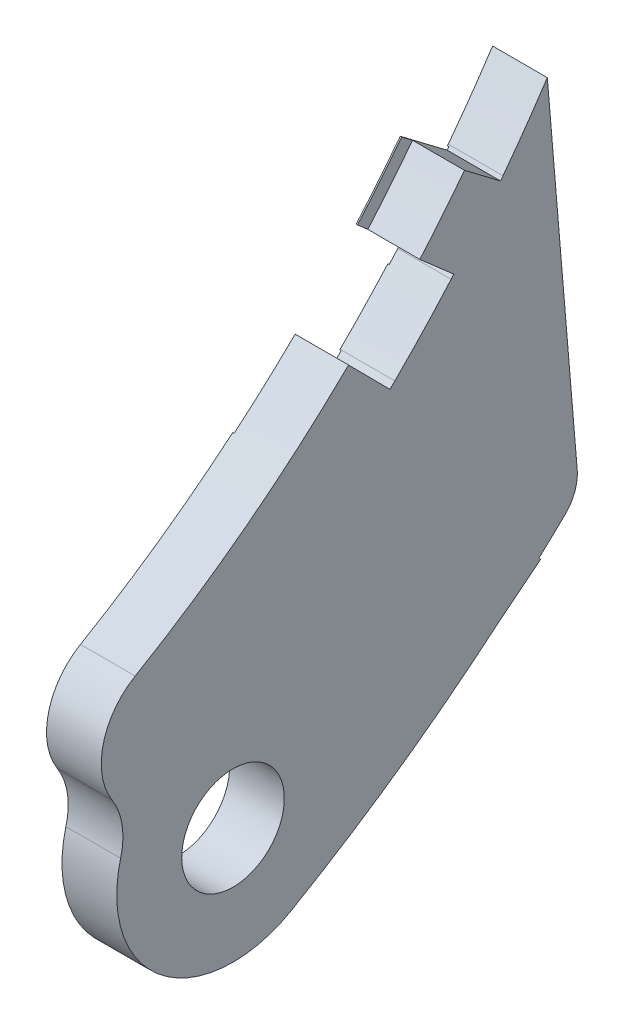
ISO-10303-21;
HEADER;
FILE_DESCRIPTION(('STEP AP214'),'2;1');
FILE_NAME('part.step','',(''),(''),'','','');
FILE_SCHEMA(('AUTOMOTIVE_DESIGN { 1 0 10303 214 1 1 1 1 }'));
ENDSEC;
DATA;
#1=APPLICATION_CONTEXT('core data for automotive mechanical design processes');
#2=APPLICATION_PROTOCOL_DEFINITION('international standard','automotive_design',2000,#1);
#3=PRODUCT_CONTEXT('',#1,'mechanical');
#4=PRODUCT('Part','Part','',(#3));
#5=PRODUCT_RELATED_PRODUCT_CATEGORY('part','',(#4));
#6=PRODUCT_DEFINITION_FORMATION('','',#4);
#7=PRODUCT_DEFINITION_CONTEXT('part definition',#1,'design');
#8=PRODUCT_DEFINITION('design','',#6,#7);
#9=PRODUCT_DEFINITION_SHAPE('','',#8);
#10=(LENGTH_UNIT() NAMED_UNIT(*) SI_UNIT(.MILLI.,.METRE.));
#11=(NAMED_UNIT(*) PLANE_ANGLE_UNIT() SI_UNIT($,.RADIAN.));
#12=(NAMED_UNIT(*) SI_UNIT($,.STERADIAN.) SOLID_ANGLE_UNIT());
#13=UNCERTAINTY_MEASURE_WITH_UNIT(LENGTH_MEASURE(1.E-05),#10,'distance_accuracy_value','');
#14=(GEOMETRIC_REPRESENTATION_CONTEXT(3) GLOBAL_UNCERTAINTY_ASSIGNED_CONTEXT((#13)) GLOBAL_UNIT_ASSIGNED_CONTEXT((#10,
#11,#12)) REPRESENTATION_CONTEXT('',''));
#15=CARTESIAN_POINT('',(0.,0.,0.));
#16=DIRECTION('',(0.,0.,1.));
#17=DIRECTION('',(1.,0.,0.));
#18=AXIS2_PLACEMENT_3D('',#15,#16,#17);
#19=CARTESIAN_POINT('',(-258.7,0.,0.));
#20=DIRECTION('',(-1.,0.,0.));
#21=DIRECTION('',(0.,0.,1.));
#22=AXIS2_PLACEMENT_3D('',#19,#20,#21);
#23=CYLINDRICAL_SURFACE('',#22,80.);
#24=DIRECTION('',(-1.,0.,0.));
#25=VECTOR('',#24,1.);
#26=CARTESIAN_POINT('',(-258.7,-52.4563861082984,-60.4013870408381));
#27=LINE('',#26,#25);
#28=CARTESIAN_POINT('',(-326.5,-52.4563861082984,-60.4013870408381));
#29=VERTEX_POINT('',#28);
#30=CARTESIAN_POINT('',(-326.4,-52.4563861082984,-60.4013870408381));
#31=VERTEX_POINT('',#30);
#32=EDGE_CURVE('E274',#29,#31,#27,.F.);
#33=ORIENTED_EDGE('',*,*,#32,.T.);
#34=CARTESIAN_POINT('',(-326.4,0.,0.));
#35=DIRECTION('',(1.,0.,0.));
#36=DIRECTION('',(0.,0.,-1.));
#37=AXIS2_PLACEMENT_3D('',#34,#35,#36);
#38=CIRCLE('',#37,80.);
#39=CARTESIAN_POINT('',(-326.4,-48.5017462472843,-63.6205989516292));
#40=VERTEX_POINT('',#39);
#41=EDGE_CURVE('E502',#31,#40,#38,.T.);
#42=ORIENTED_EDGE('',*,*,#41,.T.);
#43=DIRECTION('',(-1.,0.,0.));
#44=VECTOR('',#43,1.);
#45=CARTESIAN_POINT('',(-258.7,-48.5017462472843,-63.6205989516292));
#46=LINE('',#45,#44);
#47=CARTESIAN_POINT('',(-326.5,-48.5017462472843,-63.6205989516292));
#48=VERTEX_POINT('',#47);
#49=EDGE_CURVE('E266',#40,#48,#46,.T.);
#50=ORIENTED_EDGE('',*,*,#49,.T.);
#51=CARTESIAN_POINT('',(-326.5,0.,0.));
#52=DIRECTION('',(1.,0.,0.));
#53=DIRECTION('',(0.,0.,-1.));
#54=AXIS2_PLACEMENT_3D('',#51,#52,#53);
#55=CIRCLE('',#54,80.);
#56=EDGE_CURVE('E295',#29,#48,#55,.T.);
#57=ORIENTED_EDGE('',*,*,#56,.F.);
#58=EDGE_LOOP('',(#33,#42,#50,#57));
#59=FACE_BOUND('',#58,.T.);
#60=ADVANCED_FACE('F34',(#59),#23,.F.);
#61=CARTESIAN_POINT('',(-326.6,0.,0.));
#62=DIRECTION('',(1.,0.,0.));
#63=DIRECTION('',(0.,0.,-1.));
#64=AXIS2_PLACEMENT_3D('',#61,#62,#63);
#65=PLANE('',#64);
#66=DIRECTION('',(0.,-0.781749432604839,-0.623592675247242));
#67=VECTOR('',#66,1.);
#68=CARTESIAN_POINT('',(-326.6,12.9395480113802,-16.2213007265503));
#69=LINE('',#68,#67);
#70=CARTESIAN_POINT('',(-326.6,-50.934389216024,-67.1728175846962));
#71=VERTEX_POINT('',#70);
#72=CARTESIAN_POINT('',(-326.6,-56.1097224032477,-71.3011222983473));
#73=VERTEX_POINT('',#72);
#74=EDGE_CURVE('E356',#71,#73,#69,.T.);
#75=ORIENTED_EDGE('',*,*,#74,.F.);
#76=DIRECTION('',(0.,0.797525414576844,-0.603285349651418));
#77=VECTOR('',#76,1.);
#78=CARTESIAN_POINT('',(-326.6,-50.8569549756145,-67.2313924488279));
#79=LINE('',#78,#77);
#80=CARTESIAN_POINT('',(-326.6,-50.8569549756145,-67.2313924488279));
#81=VERTEX_POINT('',#80);
#82=EDGE_CURVE('E296',#71,#81,#79,.T.);
#83=ORIENTED_EDGE('',*,*,#82,.T.);
#84=CARTESIAN_POINT('',(-326.6,0.,0.));
#85=DIRECTION('',(1.,0.,0.));
#86=DIRECTION('',(0.,0.,-1.));
#87=AXIS2_PLACEMENT_3D('',#84,#85,#86);
#88=CIRCLE('',#87,84.3);
#89=CARTESIAN_POINT('',(-326.6,-46.2639612951835,-70.4708158408696));
#90=VERTEX_POINT('',#89);
#91=EDGE_CURVE('E298',#81,#90,#88,.T.);
#92=ORIENTED_EDGE('',*,*,#91,.T.);
#93=DIRECTION('',(0.,-0.996462965392255,-0.0840330804009582));
#94=VECTOR('',#93,1.);
#95=CARTESIAN_POINT('',(-326.6,-45.7781275192469,-70.4298448161826));
#96=LINE('',#95,#94);
#97=EDGE_CURVE('E339',#90,#73,#96,.T.);
#98=ORIENTED_EDGE('',*,*,#97,.T.);
#99=EDGE_LOOP('',(#75,#83,#92,#98));
#100=FACE_BOUND('',#99,.T.);
#101=ADVANCED_FACE('F399',(#100),#65,.F.);
#102=CARTESIAN_POINT('',(-326.5,-44.4850390372409,-62.0282439350642));
#103=DIRECTION('',(0.,-0.623592675247242,0.781749432604839));
#104=DIRECTION('',(0.,-0.781749432604839,-0.623592675247242));
#105=AXIS2_PLACEMENT_3D('',#102,#103,#104);
#106=PLANE('',#105);
#107=DIRECTION('',(1.,0.,0.));
#108=VECTOR('',#107,1.);
#109=CARTESIAN_POINT('',(-326.5,-50.934389216024,-67.1728175846962));
#110=LINE('',#109,#108);
#111=CARTESIAN_POINT('',(-326.5,-50.934389216024,-67.1728175846962));
#112=VERTEX_POINT('',#111);
#113=EDGE_CURVE('E289',#71,#112,#110,.T.);
#114=ORIENTED_EDGE('',*,*,#113,.F.);
#115=ORIENTED_EDGE('',*,*,#74,.T.);
#116=DIRECTION('',(-1.,0.,0.));
#117=VECTOR('',#116,1.);
#118=CARTESIAN_POINT('',(-322.6,-56.1097224032477,-71.3011222983473));
#119=LINE('',#118,#117);
#120=CARTESIAN_POINT('',(-326.5,-56.1097224032477,-71.3011222983473));
#121=VERTEX_POINT('',#120);
#122=EDGE_CURVE('E405',#121,#73,#119,.T.);
#123=ORIENTED_EDGE('',*,*,#122,.F.);
#124=DIRECTION('',(0.,-0.781749432604839,-0.623592675247242));
#125=VECTOR('',#124,1.);
#126=CARTESIAN_POINT('',(-326.5,-44.4850390372409,-62.0282439350642));
#127=LINE('',#126,#125);
#128=EDGE_CURVE('E294',#112,#121,#127,.T.);
#129=ORIENTED_EDGE('',*,*,#128,.F.);
#130=EDGE_LOOP('',(#114,#115,#123,#129));
#131=FACE_BOUND('',#130,.T.);
#132=ADVANCED_FACE('F580',(#131),#106,.T.);
#133=CARTESIAN_POINT('',(-326.8,-48.6631099613974,-56.7905227366117));
#134=DIRECTION('',(0.,0.623592675247242,-0.781749432604839));
#135=DIRECTION('',(0.,0.781749432604839,0.623592675247242));
#136=AXIS2_PLACEMENT_3D('',#133,#134,#135);
#137=PLANE('',#136);
#138=DIRECTION('',(1.,0.,0.));
#139=VECTOR('',#138,1.);
#140=CARTESIAN_POINT('',(-333.198032184288,-56.2182557050236,-62.8171769939128));
#141=LINE('',#140,#139);
#142=CARTESIAN_POINT('',(-326.5,-56.2182557050236,-62.8171769939128));
#143=VERTEX_POINT('',#142);
#144=CARTESIAN_POINT('',(-326.6,-56.2182557050236,-62.8171769939128));
#145=VERTEX_POINT('',#144);
#146=EDGE_CURVE('E324',#143,#145,#141,.F.);
#147=ORIENTED_EDGE('',*,*,#146,.F.);
#148=DIRECTION('',(0.,-0.781749432604839,-0.623592675247242));
#149=VECTOR('',#148,1.);
#150=CARTESIAN_POINT('',(-326.5,-48.6631099613974,-56.7905227366117));
#151=LINE('',#150,#149);
#152=CARTESIAN_POINT('',(-326.5,-68.1240676075324,-72.314308409202));
#153=VERTEX_POINT('',#152);
#154=EDGE_CURVE('E374',#143,#153,#151,.T.);
#155=ORIENTED_EDGE('',*,*,#154,.T.);
#156=DIRECTION('',(1.,0.,0.));
#157=VECTOR('',#156,1.);
#158=CARTESIAN_POINT('',(-322.6,-68.1240676075324,-72.314308409202));
#159=LINE('',#158,#157);
#160=CARTESIAN_POINT('',(-326.6,-68.1240676075324,-72.314308409202));
#161=VERTEX_POINT('',#160);
#162=EDGE_CURVE('E412',#161,#153,#159,.T.);
#163=ORIENTED_EDGE('',*,*,#162,.F.);
#164=DIRECTION('',(0.,0.781749432604839,0.623592675247242));
#165=VECTOR('',#164,1.);
#166=CARTESIAN_POINT('',(-326.6,8.76147708722366,-10.9835795280979));
#167=LINE('',#166,#165);
#168=EDGE_CURVE('E321',#161,#145,#167,.T.);
#169=ORIENTED_EDGE('',*,*,#168,.T.);
#170=EDGE_LOOP('',(#147,#155,#163,#169));
#171=FACE_BOUND('',#170,.T.);
#172=ADVANCED_FACE('F516',(#171),#137,.T.);
#173=CARTESIAN_POINT('',(-326.5,-44.4850390372409,-62.0282439350642));
#174=DIRECTION('',(1.,0.,0.));
#175=DIRECTION('',(0.,0.,-1.));
#176=AXIS2_PLACEMENT_3D('',#173,#174,#175);
#177=PLANE('',#176);
#178=CARTESIAN_POINT('',(-326.5,0.,0.));
#179=DIRECTION('',(1.,0.,0.));
#180=DIRECTION('',(0.,0.,-1.));
#181=AXIS2_PLACEMENT_3D('',#178,#179,#180);
#182=CIRCLE('',#181,84.3);
#183=CARTESIAN_POINT('',(-326.5,-55.5142080574395,-63.4402293797502));
#184=VERTEX_POINT('',#183);
#185=EDGE_CURVE('E309',#143,#184,#182,.T.);
#186=ORIENTED_EDGE('',*,*,#185,.T.);
#187=DIRECTION('',(0.,0.752553136177328,-0.6585315309305));
#188=VECTOR('',#187,1.);
#189=CARTESIAN_POINT('',(-326.5,-49.9677418369719,-68.2937376781439));
#190=LINE('',#189,#188);
#191=CARTESIAN_POINT('',(-326.5,-55.2884421165879,-63.6377888390279));
#192=VERTEX_POINT('',#191);
#193=EDGE_CURVE('E74',#184,#192,#190,.T.);
#194=ORIENTED_EDGE('',*,*,#193,.T.);
#195=DIRECTION('',(0.,-0.6585315309305,-0.752553136177328));
#196=VECTOR('',#195,1.);
#197=CARTESIAN_POINT('',(-326.5,-49.805739316857,-57.3722950959482));
#198=LINE('',#197,#196);
#199=EDGE_CURVE('E58',#29,#192,#198,.T.);
#200=ORIENTED_EDGE('',*,*,#199,.F.);
#201=ORIENTED_EDGE('',*,*,#56,.T.);
#202=DIRECTION('',(0.,0.603285349651418,0.797525414576844));
#203=VECTOR('',#202,1.);
#204=CARTESIAN_POINT('',(-326.5,-46.2737143865008,-60.6752066352263));
#205=LINE('',#204,#203);
#206=CARTESIAN_POINT('',(-326.5,-51.0962125999876,-67.0504068439325));
#207=VERTEX_POINT('',#206);
#208=EDGE_CURVE('E269',#207,#48,#205,.T.);
#209=ORIENTED_EDGE('',*,*,#208,.F.);
#210=DIRECTION('',(0.,0.797525414576844,-0.603285349651418));
#211=VECTOR('',#210,1.);
#212=CARTESIAN_POINT('',(-326.5,-49.3075372507277,-68.4034441437704));
#213=LINE('',#212,#211);
#214=EDGE_CURVE('E291',#207,#112,#213,.T.);
#215=ORIENTED_EDGE('',*,*,#214,.T.);
#216=ORIENTED_EDGE('',*,*,#128,.T.);
#217=DIRECTION('',(0.,-0.996462965392255,-0.0840330804009582));
#218=VECTOR('',#217,1.);
#219=CARTESIAN_POINT('',(-326.5,-45.7781275192469,-70.4298448161826));
#220=LINE('',#219,#218);
#221=EDGE_CURVE('E358',#121,#153,#220,.T.);
#222=ORIENTED_EDGE('',*,*,#221,.T.);
#223=ORIENTED_EDGE('',*,*,#154,.F.);
#224=EDGE_LOOP('',(#186,#194,#200,#201,#209,#215,#216,#222,#223));
#225=FACE_BOUND('',#224,.T.);
#226=ADVANCED_FACE('F512',(#225),#177,.F.);
#227=CARTESIAN_POINT('',(-326.6,-82.272413359522,-47.4999999999995));
#228=DIRECTION('',(-1.,0.,0.));
#229=DIRECTION('',(0.,0.,1.));
#230=AXIS2_PLACEMENT_3D('',#227,#228,#229);
#231=CIRCLE('',#230,3.75000000000001);
#232=CARTESIAN_POINT('',(-326.6,-82.272413359522,-43.7499999999995));
#233=VERTEX_POINT('',#232);
#234=EDGE_CURVE('E476',#233,#233,#231,.T.);
#235=ORIENTED_EDGE('',*,*,#234,.F.);
#236=EDGE_LOOP('',(#235));
#237=FACE_BOUND('',#236,.T.);
#238=DIRECTION('',(0.,0.781749432604839,0.623592675247242));
#239=VECTOR('',#238,1.);
#240=CARTESIAN_POINT('',(-326.6,1.28558516326385,-1.61163771134459));
#241=LINE('',#240,#239);
#242=CARTESIAN_POINT('',(-326.6,-79.5914848635024,-66.1263611772757));
#243=VERTEX_POINT('',#242);
#244=CARTESIAN_POINT('',(-326.6,-61.2336002625435,-51.4824843892272));
#245=VERTEX_POINT('',#244);
#246=EDGE_CURVE('E366',#243,#245,#241,.T.);
#247=ORIENTED_EDGE('',*,*,#246,.F.);
#248=DIRECTION('',(0.,0.623592675247242,-0.781749432604839));
#249=VECTOR('',#248,1.);
#250=CARTESIAN_POINT('',(-326.6,-80.8770700267663,-64.5147234659311));
#251=LINE('',#250,#249);
#252=CARTESIAN_POINT('',(-326.6,-79.0062920010249,-66.8599717637452));
#253=VERTEX_POINT('',#252);
#254=EDGE_CURVE('E424',#243,#253,#251,.T.);
#255=ORIENTED_EDGE('',*,*,#254,.T.);
#256=CARTESIAN_POINT('',(-326.6,0.,0.));
#257=DIRECTION('',(-1.,0.,0.));
#258=DIRECTION('',(0.,0.,-1.));
#259=AXIS2_PLACEMENT_3D('',#256,#257,#258);
#260=CIRCLE('',#259,103.5);
#261=CARTESIAN_POINT('',(-326.6,-89.6336292916897,-51.7499999999994));
#262=VERTEX_POINT('',#261);
#263=EDGE_CURVE('E427',#253,#262,#260,.T.);
#264=ORIENTED_EDGE('',*,*,#263,.T.);
#265=CARTESIAN_POINT('',(-326.6,-82.272413359522,-47.4999999999995));
#266=DIRECTION('',(-1.,0.,0.));
#267=DIRECTION('',(0.,0.,-1.));
#268=AXIS2_PLACEMENT_3D('',#265,#266,#267);
#269=CIRCLE('',#268,8.50000000000001);
#270=CARTESIAN_POINT('',(-326.6,-80.0832631244349,-39.2867411310597));
#271=VERTEX_POINT('',#270);
#272=EDGE_CURVE('E455',#262,#271,#269,.T.);
#273=ORIENTED_EDGE('',*,*,#272,.T.);
#274=CARTESIAN_POINT('',(-326.6,-78.7955276920308,-34.4554123846245));
#275=DIRECTION('',(1.,0.,0.));
#276=DIRECTION('',(0.,0.,-1.));
#277=AXIS2_PLACEMENT_3D('',#274,#275,#276);
#278=CIRCLE('',#277,5.);
#279=CARTESIAN_POINT('',(-326.6,-76.0957327643658,-38.663869031491));
#280=VERTEX_POINT('',#279);
#281=EDGE_CURVE('E459',#271,#280,#278,.T.);
#282=ORIENTED_EDGE('',*,*,#281,.T.);
#283=CARTESIAN_POINT('',(-326.6,-73.3959378367008,-42.8723256783574));
#284=DIRECTION('',(-1.,0.,0.));
#285=DIRECTION('',(0.,0.,1.));
#286=AXIS2_PLACEMENT_3D('',#283,#284,#285);
#287=CIRCLE('',#286,5.);
#288=CARTESIAN_POINT('',(-326.6,-69.0785297286596,-40.3504241678658));
#289=VERTEX_POINT('',#288);
#290=EDGE_CURVE('E463',#280,#289,#287,.T.);
#291=ORIENTED_EDGE('',*,*,#290,.T.);
#292=CARTESIAN_POINT('',(-326.6,0.,0.));
#293=DIRECTION('',(1.,0.,0.));
#294=DIRECTION('',(0.,0.,-1.));
#295=AXIS2_PLACEMENT_3D('',#292,#293,#294);
#296=CIRCLE('',#295,80.);
#297=EDGE_CURVE('E440',#289,#245,#296,.T.);
#298=ORIENTED_EDGE('',*,*,#297,.T.);
#299=EDGE_LOOP('',(#247,#255,#264,#273,#282,#291,#298));
#300=FACE_BOUND('',#299,.T.);
#301=ADVANCED_FACE('F552',(#237,#300),#65,.F.);
#302=CARTESIAN_POINT('',(-322.6,-82.272413359522,-47.4999999999995));
#303=DIRECTION('',(-1.,0.,0.));
#304=DIRECTION('',(0.,0.,1.));
#305=AXIS2_PLACEMENT_3D('',#302,#303,#304);
#306=CYLINDRICAL_SURFACE('',#305,3.75000000000001);
#307=CARTESIAN_POINT('',(-322.6,-82.272413359522,-47.4999999999995));
#308=DIRECTION('',(-1.,0.,0.));
#309=DIRECTION('',(0.,0.,1.));
#310=AXIS2_PLACEMENT_3D('',#307,#308,#309);
#311=CIRCLE('',#310,3.75000000000001);
#312=CARTESIAN_POINT('',(-322.6,-82.272413359522,-43.7499999999995));
#313=VERTEX_POINT('',#312);
#314=EDGE_CURVE('E303',#313,#313,#311,.T.);
#315=ORIENTED_EDGE('',*,*,#314,.F.);
#316=EDGE_LOOP('',(#315));
#317=FACE_BOUND('',#316,.T.);
#318=ORIENTED_EDGE('',*,*,#234,.T.);
#319=EDGE_LOOP('',(#318));
#320=FACE_BOUND('',#319,.T.);
#321=ADVANCED_FACE('F599',(#317,#320),#306,.F.);
#322=CARTESIAN_POINT('',(-326.7,-55.2884421165879,-63.6377888390279));
#323=DIRECTION('',(0.,-0.6585315309305,-0.752553136177328));
#324=DIRECTION('',(0.,0.752553136177328,-0.6585315309305));
#325=AXIS2_PLACEMENT_3D('',#322,#323,#324);
#326=PLANE('',#325);
#327=DIRECTION('',(0.,0.752553136177328,-0.6585315309305));
#328=VECTOR('',#327,1.);
#329=CARTESIAN_POINT('',(-322.6,-55.5142080574411,-63.4402293797487));
#330=LINE('',#329,#328);
#331=CARTESIAN_POINT('',(-322.6,-55.5142080574411,-63.4402293797487));
#332=VERTEX_POINT('',#331);
#333=CARTESIAN_POINT('',(-322.6,-55.2884421165879,-63.6377888390279));
#334=VERTEX_POINT('',#333);
#335=EDGE_CURVE('E286',#332,#334,#330,.T.);
#336=ORIENTED_EDGE('',*,*,#335,.T.);
#337=DIRECTION('',(1.,0.,0.));
#338=VECTOR('',#337,1.);
#339=CARTESIAN_POINT('',(-326.7,-55.2884421165879,-63.6377888390279));
#340=LINE('',#339,#338);
#341=EDGE_CURVE('E306',#192,#334,#340,.T.);
#342=ORIENTED_EDGE('',*,*,#341,.F.);
#343=ORIENTED_EDGE('',*,*,#193,.F.);
#344=DIRECTION('',(1.,0.,0.));
#345=VECTOR('',#344,1.);
#346=CARTESIAN_POINT('',(-333.198032184288,-55.5142080574395,-63.4402293797502));
#347=LINE('',#346,#345);
#348=EDGE_CURVE('E70',#184,#332,#347,.T.);
#349=ORIENTED_EDGE('',*,*,#348,.T.);
#350=EDGE_LOOP('',(#336,#342,#343,#349));
#351=FACE_BOUND('',#350,.T.);
#352=ADVANCED_FACE('F509',(#351),#326,.F.);
#353=CARTESIAN_POINT('',(0.,0.225765940853231,-0.197559459279142));
#354=DIRECTION('',(0.,-0.752553136177328,0.6585315309305));
#355=DIRECTION('',(0.,-0.6585315309305,-0.752553136177328));
#356=AXIS2_PLACEMENT_3D('',#353,#354,#355);
#357=PLANE('',#356);
#358=DIRECTION('',(-1.,0.,0.));
#359=VECTOR('',#358,1.);
#360=CARTESIAN_POINT('',(-258.7,-53.1149222124121,-61.1539454031333));
#361=LINE('',#360,#359);
#362=CARTESIAN_POINT('',(-326.4,-53.1149222124121,-61.1539454031333));
#363=VERTEX_POINT('',#362);
#364=CARTESIAN_POINT('',(-322.6,-53.1149222124121,-61.1539454031333));
#365=VERTEX_POINT('',#364);
#366=EDGE_CURVE('E49',#363,#365,#361,.F.);
#367=ORIENTED_EDGE('',*,*,#366,.F.);
#368=DIRECTION('',(0.,0.6585315309305,0.752553136177328));
#369=VECTOR('',#368,1.);
#370=CARTESIAN_POINT('',(-326.4,0.225765940853218,-0.197559459279163));
#371=LINE('',#370,#369);
#372=EDGE_CURVE('E261',#363,#31,#371,.T.);
#373=ORIENTED_EDGE('',*,*,#372,.T.);
#374=ORIENTED_EDGE('',*,*,#32,.F.);
#375=ORIENTED_EDGE('',*,*,#199,.T.);
#376=ORIENTED_EDGE('',*,*,#341,.T.);
#377=DIRECTION('',(0.,-0.6585315309305,-0.752553136177328));
#378=VECTOR('',#377,1.);
#379=CARTESIAN_POINT('',(-322.6,0.225765940853218,-0.197559459279156));
#380=LINE('',#379,#378);
#381=EDGE_CURVE('E302',#365,#334,#380,.T.);
#382=ORIENTED_EDGE('',*,*,#381,.F.);
#383=EDGE_LOOP('',(#367,#373,#374,#375,#376,#382));
#384=FACE_BOUND('',#383,.T.);
#385=ADVANCED_FACE('F504',(#384),#357,.T.);
#386=CARTESIAN_POINT('',(0.,-0.239257624373088,0.180985604895462));
#387=DIRECTION('',(0.,0.797525414576844,-0.603285349651418));
#388=DIRECTION('',(0.,0.603285349651418,0.797525414576844));
#389=AXIS2_PLACEMENT_3D('',#386,#387,#388);
#390=PLANE('',#389);
#391=DIRECTION('',(-1.,0.,0.));
#392=VECTOR('',#391,1.);
#393=CARTESIAN_POINT('',(-258.7,-49.1050357864609,-64.4181299046347));
#394=LINE('',#393,#392);
#395=CARTESIAN_POINT('',(-322.6,-49.1050357864609,-64.4181299046347));
#396=VERTEX_POINT('',#395);
#397=CARTESIAN_POINT('',(-326.4,-49.1050357864609,-64.4181299046347));
#398=VERTEX_POINT('',#397);
#399=EDGE_CURVE('E250',#396,#398,#394,.T.);
#400=ORIENTED_EDGE('',*,*,#399,.F.);
#401=DIRECTION('',(0.,0.603285349651418,0.797525414576844));
#402=VECTOR('',#401,1.);
#403=CARTESIAN_POINT('',(-322.6,-0.239257624373088,0.180985604895455));
#404=LINE('',#403,#402);
#405=CARTESIAN_POINT('',(-322.6,-51.0962125999876,-67.0504068439325));
#406=VERTEX_POINT('',#405);
#407=EDGE_CURVE('E277',#406,#396,#404,.T.);
#408=ORIENTED_EDGE('',*,*,#407,.F.);
#409=DIRECTION('',(-1.,0.,0.));
#410=VECTOR('',#409,1.);
#411=CARTESIAN_POINT('',(-326.7,-51.0962125999876,-67.0504068439325));
#412=LINE('',#411,#410);
#413=EDGE_CURVE('E287',#406,#207,#412,.T.);
#414=ORIENTED_EDGE('',*,*,#413,.T.);
#415=ORIENTED_EDGE('',*,*,#208,.T.);
#416=ORIENTED_EDGE('',*,*,#49,.F.);
#417=DIRECTION('',(0.,-0.603285349651418,-0.797525414576844));
#418=VECTOR('',#417,1.);
#419=CARTESIAN_POINT('',(-326.4,-0.239257624373088,0.180985604895462));
#420=LINE('',#419,#418);
#421=EDGE_CURVE('E11',#40,#398,#420,.T.);
#422=ORIENTED_EDGE('',*,*,#421,.T.);
#423=EDGE_LOOP('',(#400,#408,#414,#415,#416,#422));
#424=FACE_BOUND('',#423,.T.);
#425=ADVANCED_FACE('F264',(#424),#390,.T.);
#426=CARTESIAN_POINT('',(-326.7,-51.0962125999876,-67.0504068439325));
#427=DIRECTION('',(0.,-0.603285349651418,-0.797525414576844));
#428=DIRECTION('',(0.,0.797525414576844,-0.603285349651418));
#429=AXIS2_PLACEMENT_3D('',#426,#427,#428);
#430=PLANE('',#429);
#431=DIRECTION('',(0.,0.797525414576844,-0.603285349651418));
#432=VECTOR('',#431,1.);
#433=CARTESIAN_POINT('',(-322.6,-50.8569549756145,-67.2313924488279));
#434=LINE('',#433,#432);
#435=CARTESIAN_POINT('',(-322.6,-50.8569549756148,-67.2313924488277));
#436=VERTEX_POINT('',#435);
#437=EDGE_CURVE('E109',#406,#436,#434,.T.);
#438=ORIENTED_EDGE('',*,*,#437,.T.);
#439=DIRECTION('',(1.,0.,0.));
#440=VECTOR('',#439,1.);
#441=CARTESIAN_POINT('',(-333.198032184288,-50.8569549756148,-67.2313924488277));
#442=LINE('',#441,#440);
#443=EDGE_CURVE('E103',#81,#436,#442,.T.);
#444=ORIENTED_EDGE('',*,*,#443,.F.);
#445=ORIENTED_EDGE('',*,*,#82,.F.);
#446=ORIENTED_EDGE('',*,*,#113,.T.);
#447=ORIENTED_EDGE('',*,*,#214,.F.);
#448=ORIENTED_EDGE('',*,*,#413,.F.);
#449=EDGE_LOOP('',(#438,#444,#445,#446,#447,#448));
#450=FACE_BOUND('',#449,.T.);
#451=ADVANCED_FACE('F749',(#450),#430,.F.);
#452=CARTESIAN_POINT('',(-333.198032184288,0.,0.));
#453=DIRECTION('',(1.,0.,0.));
#454=DIRECTION('',(0.,0.,-1.));
#455=AXIS2_PLACEMENT_3D('',#452,#453,#454);
#456=CYLINDRICAL_SURFACE('',#455,84.3);
#457=ORIENTED_EDGE('',*,*,#443,.T.);
#458=CARTESIAN_POINT('',(-322.6,0.,0.));
#459=DIRECTION('',(1.,0.,0.));
#460=DIRECTION('',(0.,0.,-1.));
#461=AXIS2_PLACEMENT_3D('',#458,#459,#460);
#462=CIRCLE('',#461,84.3);
#463=CARTESIAN_POINT('',(-322.6,-46.2639612951835,-70.4708158408696));
#464=VERTEX_POINT('',#463);
#465=EDGE_CURVE('E320',#436,#464,#462,.T.);
#466=ORIENTED_EDGE('',*,*,#465,.T.);
#467=DIRECTION('',(1.,0.,0.));
#468=VECTOR('',#467,1.);
#469=CARTESIAN_POINT('',(-333.198032184288,-46.2639612951835,-70.4708158408696));
#470=LINE('',#469,#468);
#471=EDGE_CURVE('E332',#464,#90,#470,.F.);
#472=ORIENTED_EDGE('',*,*,#471,.T.);
#473=ORIENTED_EDGE('',*,*,#91,.F.);
#474=EDGE_LOOP('',(#457,#466,#472,#473));
#475=FACE_BOUND('',#474,.T.);
#476=ADVANCED_FACE('F623',(#475),#456,.F.);
#477=CARTESIAN_POINT('',(-322.6,-45.7781275192469,-70.4298448161826));
#478=DIRECTION('',(0.,0.0840330804009581,-0.996462965392255));
#479=DIRECTION('',(0.,0.996462965392255,0.0840330804009582));
#480=AXIS2_PLACEMENT_3D('',#477,#478,#479);
#481=PLANE('',#480);
#482=ORIENTED_EDGE('',*,*,#471,.F.);
#483=DIRECTION('',(0.,-0.996462965392255,-0.0840330804009582));
#484=VECTOR('',#483,1.);
#485=CARTESIAN_POINT('',(-322.6,-45.7781275192469,-70.4298448161826));
#486=LINE('',#485,#484);
#487=CARTESIAN_POINT('',(-322.6,-72.1822694264871,-72.6565421013506));
#488=VERTEX_POINT('',#487);
#489=EDGE_CURVE('E437',#464,#488,#486,.T.);
#490=ORIENTED_EDGE('',*,*,#489,.T.);
#491=DIRECTION('',(-1.,0.,0.));
#492=VECTOR('',#491,1.);
#493=CARTESIAN_POINT('',(-322.6,-72.1822694264871,-72.6565421013506));
#494=LINE('',#493,#492);
#495=CARTESIAN_POINT('',(-326.6,-72.1822694264871,-72.6565421013506));
#496=VERTEX_POINT('',#495);
#497=EDGE_CURVE('E415',#488,#496,#494,.T.);
#498=ORIENTED_EDGE('',*,*,#497,.T.);
#499=EDGE_CURVE('E383',#161,#496,#96,.T.);
#500=ORIENTED_EDGE('',*,*,#499,.F.);
#501=ORIENTED_EDGE('',*,*,#162,.T.);
#502=ORIENTED_EDGE('',*,*,#221,.F.);
#503=ORIENTED_EDGE('',*,*,#122,.T.);
#504=ORIENTED_EDGE('',*,*,#97,.F.);
#505=EDGE_LOOP('',(#482,#490,#498,#500,#501,#502,#503,#504));
#506=FACE_BOUND('',#505,.T.);
#507=ADVANCED_FACE('F406',(#506),#481,.T.);
#508=CARTESIAN_POINT('',(-322.6,-72.43436866769,-69.6671532051739));
#509=DIRECTION('',(-1.,0.,0.));
#510=DIRECTION('',(0.,0.,1.));
#511=AXIS2_PLACEMENT_3D('',#508,#509,#510);
#512=CYLINDRICAL_SURFACE('',#511,3.);
#513=CARTESIAN_POINT('',(-322.6,-72.43436866769,-69.6671532051739));
#514=DIRECTION('',(1.,0.,0.));
#515=DIRECTION('',(0.,0.,-1.));
#516=AXIS2_PLACEMENT_3D('',#513,#514,#515);
#517=CIRCLE('',#516,3.);
#518=CARTESIAN_POINT('',(-322.6,-74.5965886279196,-71.7467697187612));
#519=VERTEX_POINT('',#518);
#520=EDGE_CURVE('E273',#519,#488,#517,.T.);
#521=ORIENTED_EDGE('',*,*,#520,.F.);
#522=DIRECTION('',(-1.,0.,0.));
#523=VECTOR('',#522,1.);
#524=CARTESIAN_POINT('',(-322.6,-74.5965886279196,-71.7467697187611));
#525=LINE('',#524,#523);
#526=CARTESIAN_POINT('',(-326.6,-74.5965886279196,-71.7467697187612));
#527=VERTEX_POINT('',#526);
#528=EDGE_CURVE('E432',#527,#519,#525,.F.);
#529=ORIENTED_EDGE('',*,*,#528,.F.);
#530=CARTESIAN_POINT('',(-326.6,-72.43436866769,-69.6671532051739));
#531=DIRECTION('',(1.,0.,0.));
#532=DIRECTION('',(0.,0.,-1.));
#533=AXIS2_PLACEMENT_3D('',#530,#531,#532);
#534=CIRCLE('',#533,3.);
#535=EDGE_CURVE('E386',#496,#527,#534,.F.);
#536=ORIENTED_EDGE('',*,*,#535,.F.);
#537=ORIENTED_EDGE('',*,*,#497,.F.);
#538=EDGE_LOOP('',(#521,#529,#536,#537));
#539=FACE_BOUND('',#538,.T.);
#540=ADVANCED_FACE('F522',(#539),#512,.T.);
#541=CARTESIAN_POINT('',(-322.6,0.,0.));
#542=DIRECTION('',(-1.,0.,0.));
#543=DIRECTION('',(0.,0.,1.));
#544=AXIS2_PLACEMENT_3D('',#541,#542,#543);
#545=CYLINDRICAL_SURFACE('',#544,103.5);
#546=ORIENTED_EDGE('',*,*,#263,.F.);
#547=DIRECTION('',(-1.,0.,0.));
#548=VECTOR('',#547,1.);
#549=CARTESIAN_POINT('',(-322.6,-79.0062920010269,-66.8599717637428));
#550=LINE('',#549,#548);
#551=CARTESIAN_POINT('',(-326.5,-79.0062920010268,-66.8599717637427));
#552=VERTEX_POINT('',#551);
#553=EDGE_CURVE('E371',#552,#253,#550,.T.);
#554=ORIENTED_EDGE('',*,*,#553,.F.);
#555=DIRECTION('',(-1.,0.,0.));
#556=VECTOR('',#555,1.);
#557=CARTESIAN_POINT('',(-258.7,-79.0062920010245,-66.8599717637455));
#558=LINE('',#557,#556);
#559=CARTESIAN_POINT('',(-322.6,-79.0062920010249,-66.8599717637452));
#560=VERTEX_POINT('',#559);
#561=EDGE_CURVE('E311',#560,#552,#558,.T.);
#562=ORIENTED_EDGE('',*,*,#561,.F.);
#563=CARTESIAN_POINT('',(-322.6,0.,0.));
#564=DIRECTION('',(-1.,0.,0.));
#565=DIRECTION('',(0.,0.,-1.));
#566=AXIS2_PLACEMENT_3D('',#563,#564,#565);
#567=CIRCLE('',#566,103.5);
#568=CARTESIAN_POINT('',(-322.6,-89.6336292916897,-51.7499999999994));
#569=VERTEX_POINT('',#568);
#570=EDGE_CURVE('E443',#560,#569,#567,.T.);
#571=ORIENTED_EDGE('',*,*,#570,.T.);
#572=DIRECTION('',(-1.,0.,0.));
#573=VECTOR('',#572,1.);
#574=CARTESIAN_POINT('',(-322.6,-89.6336292916897,-51.7499999999994));
#575=LINE('',#574,#573);
#576=EDGE_CURVE('E367',#569,#262,#575,.T.);
#577=ORIENTED_EDGE('',*,*,#576,.T.);
#578=EDGE_LOOP('',(#546,#554,#562,#571,#577));
#579=FACE_BOUND('',#578,.T.);
#580=ADVANCED_FACE('F542',(#579),#545,.T.);
#581=CARTESIAN_POINT('',(-322.6,-82.272413359522,-47.4999999999995));
#582=DIRECTION('',(-1.,0.,0.));
#583=DIRECTION('',(0.,0.,1.));
#584=AXIS2_PLACEMENT_3D('',#581,#582,#583);
#585=CYLINDRICAL_SURFACE('',#584,8.50000000000001);
#586=ORIENTED_EDGE('',*,*,#272,.F.);
#587=ORIENTED_EDGE('',*,*,#576,.F.);
#588=CARTESIAN_POINT('',(-322.6,-82.272413359522,-47.4999999999995));
#589=DIRECTION('',(-1.,0.,0.));
#590=DIRECTION('',(0.,0.,-1.));
#591=AXIS2_PLACEMENT_3D('',#588,#589,#590);
#592=CIRCLE('',#591,8.50000000000001);
#593=CARTESIAN_POINT('',(-322.6,-80.0832631244349,-39.2867411310597));
#594=VERTEX_POINT('',#593);
#595=EDGE_CURVE('E447',#569,#594,#592,.T.);
#596=ORIENTED_EDGE('',*,*,#595,.T.);
#597=DIRECTION('',(-1.,0.,0.));
#598=VECTOR('',#597,1.);
#599=CARTESIAN_POINT('',(-322.6,-80.0832631244349,-39.2867411310597));
#600=LINE('',#599,#598);
#601=EDGE_CURVE('E444',#594,#271,#600,.T.);
#602=ORIENTED_EDGE('',*,*,#601,.T.);
#603=EDGE_LOOP('',(#586,#587,#596,#602));
#604=FACE_BOUND('',#603,.T.);
#605=ADVANCED_FACE('F545',(#604),#585,.T.);
#606=CARTESIAN_POINT('',(-322.6,-78.7955276920308,-34.4554123846245));
#607=DIRECTION('',(-1.,0.,0.));
#608=DIRECTION('',(0.,0.,1.));
#609=AXIS2_PLACEMENT_3D('',#606,#607,#608);
#610=CYLINDRICAL_SURFACE('',#609,5.);
#611=ORIENTED_EDGE('',*,*,#281,.F.);
#612=ORIENTED_EDGE('',*,*,#601,.F.);
#613=CARTESIAN_POINT('',(-322.6,-78.7955276920308,-34.4554123846245));
#614=DIRECTION('',(1.,0.,0.));
#615=DIRECTION('',(0.,0.,-1.));
#616=AXIS2_PLACEMENT_3D('',#613,#614,#615);
#617=CIRCLE('',#616,5.);
#618=CARTESIAN_POINT('',(-322.6,-76.0957327643658,-38.663869031491));
#619=VERTEX_POINT('',#618);
#620=EDGE_CURVE('E446',#594,#619,#617,.T.);
#621=ORIENTED_EDGE('',*,*,#620,.T.);
#622=DIRECTION('',(-1.,0.,0.));
#623=VECTOR('',#622,1.);
#624=CARTESIAN_POINT('',(-322.6,-76.0957327643658,-38.663869031491));
#625=LINE('',#624,#623);
#626=EDGE_CURVE('E448',#619,#280,#625,.T.);
#627=ORIENTED_EDGE('',*,*,#626,.T.);
#628=EDGE_LOOP('',(#611,#612,#621,#627));
#629=FACE_BOUND('',#628,.T.);
#630=ADVANCED_FACE('F548',(#629),#610,.F.);
#631=CARTESIAN_POINT('',(-322.6,-73.3959378367008,-42.8723256783574));
#632=DIRECTION('',(-1.,0.,0.));
#633=DIRECTION('',(0.,0.,1.));
#634=AXIS2_PLACEMENT_3D('',#631,#632,#633);
#635=CYLINDRICAL_SURFACE('',#634,5.);
#636=ORIENTED_EDGE('',*,*,#290,.F.);
#637=ORIENTED_EDGE('',*,*,#626,.F.);
#638=CARTESIAN_POINT('',(-322.6,-73.3959378367008,-42.8723256783574));
#639=DIRECTION('',(-1.,0.,0.));
#640=DIRECTION('',(0.,0.,1.));
#641=AXIS2_PLACEMENT_3D('',#638,#639,#640);
#642=CIRCLE('',#641,5.);
#643=CARTESIAN_POINT('',(-322.6,-69.0785297286596,-40.3504241678658));
#644=VERTEX_POINT('',#643);
#645=EDGE_CURVE('E450',#619,#644,#642,.T.);
#646=ORIENTED_EDGE('',*,*,#645,.T.);
#647=DIRECTION('',(-1.,0.,0.));
#648=VECTOR('',#647,1.);
#649=CARTESIAN_POINT('',(-322.6,-69.0785297286596,-40.3504241678658));
#650=LINE('',#649,#648);
#651=EDGE_CURVE('E451',#644,#289,#650,.T.);
#652=ORIENTED_EDGE('',*,*,#651,.T.);
#653=EDGE_LOOP('',(#636,#637,#646,#652));
#654=FACE_BOUND('',#653,.T.);
#655=ADVANCED_FACE('F556',(#654),#635,.T.);
#656=CARTESIAN_POINT('',(-326.8,-56.1390018853572,-47.4185809198585));
#657=DIRECTION('',(0.,0.623592675247242,-0.781749432604839));
#658=DIRECTION('',(0.,0.781749432604839,0.623592675247242));
#659=AXIS2_PLACEMENT_3D('',#656,#657,#658);
#660=PLANE('',#659);
#661=DIRECTION('',(0.,-0.781749432604839,-0.623592675247242));
#662=VECTOR('',#661,1.);
#663=CARTESIAN_POINT('',(-326.5,-56.1390018853572,-47.4185809198585));
#664=LINE('',#663,#662);
#665=CARTESIAN_POINT('',(-326.5,-61.2336002625435,-51.4824843892272));
#666=VERTEX_POINT('',#665);
#667=CARTESIAN_POINT('',(-326.5,-79.5914848635024,-66.1263611772757));
#668=VERTEX_POINT('',#667);
#669=EDGE_CURVE('E363',#666,#668,#664,.T.);
#670=ORIENTED_EDGE('',*,*,#669,.T.);
#671=DIRECTION('',(1.,0.,0.));
#672=VECTOR('',#671,1.);
#673=CARTESIAN_POINT('',(-326.8,-79.5914848635024,-66.1263611772757));
#674=LINE('',#673,#672);
#675=EDGE_CURVE('E368',#243,#668,#674,.T.);
#676=ORIENTED_EDGE('',*,*,#675,.F.);
#677=ORIENTED_EDGE('',*,*,#246,.T.);
#678=DIRECTION('',(-1.,0.,0.));
#679=VECTOR('',#678,1.);
#680=CARTESIAN_POINT('',(-258.7,-61.2336002625435,-51.4824843892272));
#681=LINE('',#680,#679);
#682=EDGE_CURVE('E469',#666,#245,#681,.T.);
#683=ORIENTED_EDGE('',*,*,#682,.F.);
#684=EDGE_LOOP('',(#670,#676,#677,#683));
#685=FACE_BOUND('',#684,.T.);
#686=ADVANCED_FACE('F561',(#685),#660,.T.);
#687=CARTESIAN_POINT('',(0.,-80.8770700267663,-64.5147234659311));
#688=DIRECTION('',(0.,-0.781749432604839,-0.623592675247243));
#689=DIRECTION('',(1.,0.,0.));
#690=AXIS2_PLACEMENT_3D('',#687,#688,#689);
#691=PLANE('',#690);
#692=ORIENTED_EDGE('',*,*,#553,.T.);
#693=ORIENTED_EDGE('',*,*,#254,.F.);
#694=ORIENTED_EDGE('',*,*,#675,.T.);
#695=DIRECTION('',(0.,-0.623592675247242,0.781749432604839));
#696=VECTOR('',#695,1.);
#697=CARTESIAN_POINT('',(-326.5,-79.5914848635024,-66.1263611772757));
#698=LINE('',#697,#696);
#699=EDGE_CURVE('E370',#668,#552,#698,.F.);
#700=ORIENTED_EDGE('',*,*,#699,.T.);
#701=EDGE_LOOP('',(#692,#693,#694,#700));
#702=FACE_BOUND('',#701,.T.);
#703=ADVANCED_FACE('F565',(#702),#691,.F.);
#704=CARTESIAN_POINT('',(-392.796966999625,-76.5119213000356,-69.9869694941648));
#705=DIRECTION('',(0.,-0.781749432604839,-0.623592675247242));
#706=DIRECTION('',(0.,0.623592675247242,-0.781749432604839));
#707=AXIS2_PLACEMENT_3D('',#704,#705,#706);
#708=PLANE('',#707);
#709=ORIENTED_EDGE('',*,*,#561,.T.);
#710=CARTESIAN_POINT('',(-326.5,-76.5119213000357,-69.9869694941649));
#711=VERTEX_POINT('',#710);
#712=EDGE_CURVE('E314',#552,#711,#698,.F.);
#713=ORIENTED_EDGE('',*,*,#712,.T.);
#714=DIRECTION('',(1.,0.,0.));
#715=VECTOR('',#714,1.);
#716=CARTESIAN_POINT('',(-392.796966999625,-76.5119213000356,-69.9869694941648));
#717=LINE('',#716,#715);
#718=CARTESIAN_POINT('',(-322.6,-76.5119213000357,-69.9869694941649));
#719=VERTEX_POINT('',#718);
#720=EDGE_CURVE('E316',#711,#719,#717,.T.);
#721=ORIENTED_EDGE('',*,*,#720,.T.);
#722=DIRECTION('',(0.,-0.623592675247242,0.781749432604839));
#723=VECTOR('',#722,1.);
#724=CARTESIAN_POINT('',(-322.6,-75.2647359495411,-71.5504683593746));
#725=LINE('',#724,#723);
#726=EDGE_CURVE('E318',#719,#560,#725,.T.);
#727=ORIENTED_EDGE('',*,*,#726,.T.);
#728=EDGE_LOOP('',(#709,#713,#721,#727));
#729=FACE_BOUND('',#728,.T.);
#730=ADVANCED_FACE('F535',(#729),#708,.T.);
#731=CARTESIAN_POINT('',(-392.796966999625,-61.073396129291,-57.6718326848965));
#732=DIRECTION('',(0.,0.623592675247241,-0.78174943260484));
#733=DIRECTION('',(0.,0.78174943260484,0.623592675247241));
#734=AXIS2_PLACEMENT_3D('',#731,#732,#733);
#735=PLANE('',#734);
#736=ORIENTED_EDGE('',*,*,#720,.F.);
#737=DIRECTION('',(0.,0.78174943260484,0.623592675247241));
#738=VECTOR('',#737,1.);
#739=CARTESIAN_POINT('',(-326.5,-61.073396129291,-57.6718326848965));
#740=LINE('',#739,#738);
#741=CARTESIAN_POINT('',(-326.5,-76.3606536483423,-69.8663050003212));
#742=VERTEX_POINT('',#741);
#743=EDGE_CURVE('E411',#711,#742,#740,.T.);
#744=ORIENTED_EDGE('',*,*,#743,.T.);
#745=DIRECTION('',(-1.,0.,0.));
#746=VECTOR('',#745,1.);
#747=CARTESIAN_POINT('',(-322.6,-76.3606536483423,-69.8663050003212));
#748=LINE('',#747,#746);
#749=CARTESIAN_POINT('',(-322.6,-76.3606536483423,-69.8663050003212));
#750=VERTEX_POINT('',#749);
#751=EDGE_CURVE('E430',#750,#742,#748,.T.);
#752=ORIENTED_EDGE('',*,*,#751,.F.);
#753=DIRECTION('',(0.,-0.78174943260484,-0.623592675247241));
#754=VECTOR('',#753,1.);
#755=CARTESIAN_POINT('',(-322.6,-61.073396129291,-57.6718326848965));
#756=LINE('',#755,#754);
#757=EDGE_CURVE('E315',#750,#719,#756,.T.);
#758=ORIENTED_EDGE('',*,*,#757,.T.);
#759=EDGE_LOOP('',(#736,#744,#752,#758));
#760=FACE_BOUND('',#759,.T.);
#761=ADVANCED_FACE('F531',(#760),#735,.T.);
#762=ORIENTED_EDGE('',*,*,#751,.T.);
#763=CARTESIAN_POINT('',(-326.5,0.,0.));
#764=DIRECTION('',(-1.,0.,0.));
#765=DIRECTION('',(0.,0.,1.));
#766=AXIS2_PLACEMENT_3D('',#763,#764,#765);
#767=CIRCLE('',#766,103.5);
#768=CARTESIAN_POINT('',(-326.5,-74.9922497842851,-71.3331092291048));
#769=VERTEX_POINT('',#768);
#770=EDGE_CURVE('E428',#742,#769,#767,.F.);
#771=ORIENTED_EDGE('',*,*,#770,.T.);
#772=DIRECTION('',(-1.,0.,0.));
#773=VECTOR('',#772,1.);
#774=CARTESIAN_POINT('',(-322.6,-74.9922497842851,-71.3331092291048));
#775=LINE('',#774,#773);
#776=CARTESIAN_POINT('',(-326.6,-74.9922497842851,-71.3331092291048));
#777=VERTEX_POINT('',#776);
#778=EDGE_CURVE('E354',#769,#777,#775,.T.);
#779=ORIENTED_EDGE('',*,*,#778,.T.);
#780=EDGE_CURVE('E390',#527,#777,#260,.T.);
#781=ORIENTED_EDGE('',*,*,#780,.F.);
#782=ORIENTED_EDGE('',*,*,#528,.T.);
#783=EDGE_CURVE('E433',#519,#750,#567,.T.);
#784=ORIENTED_EDGE('',*,*,#783,.T.);
#785=EDGE_LOOP('',(#762,#771,#779,#781,#782,#784));
#786=FACE_BOUND('',#785,.T.);
#787=ADVANCED_FACE('F525',(#786),#545,.T.);
#788=CARTESIAN_POINT('',(-326.5,-51.812252971396,-52.8426881019573));
#789=DIRECTION('',(0.,-0.623592675247242,0.781749432604839));
#790=DIRECTION('',(0.,-0.781749432604839,-0.623592675247242));
#791=AXIS2_PLACEMENT_3D('',#788,#789,#790);
#792=PLANE('',#791);
#793=DIRECTION('',(1.,0.,0.));
#794=VECTOR('',#793,1.);
#795=CARTESIAN_POINT('',(-326.5,-59.9124980517319,-59.3041619312044));
#796=LINE('',#795,#794);
#797=CARTESIAN_POINT('',(-326.6,-59.9124980517319,-59.3041619312044));
#798=VERTEX_POINT('',#797);
#799=CARTESIAN_POINT('',(-326.5,-59.9124980517319,-59.3041619312044));
#800=VERTEX_POINT('',#799);
#801=EDGE_CURVE('E325',#798,#800,#796,.T.);
#802=ORIENTED_EDGE('',*,*,#801,.F.);
#803=DIRECTION('',(0.,-0.781749432604839,-0.623592675247242));
#804=VECTOR('',#803,1.);
#805=CARTESIAN_POINT('',(-326.6,5.6123340772251,-7.03574489344343));
#806=LINE('',#805,#804);
#807=EDGE_CURVE('E423',#798,#777,#806,.T.);
#808=ORIENTED_EDGE('',*,*,#807,.T.);
#809=ORIENTED_EDGE('',*,*,#778,.F.);
#810=DIRECTION('',(0.,-0.781749432604839,-0.623592675247242));
#811=VECTOR('',#810,1.);
#812=CARTESIAN_POINT('',(-326.5,-51.812252971396,-52.8426881019573));
#813=LINE('',#812,#811);
#814=EDGE_CURVE('E299',#800,#769,#813,.T.);
#815=ORIENTED_EDGE('',*,*,#814,.F.);
#816=EDGE_LOOP('',(#802,#808,#809,#815));
#817=FACE_BOUND('',#816,.T.);
#818=ADVANCED_FACE('F352',(#817),#792,.T.);
#819=ORIENTED_EDGE('',*,*,#807,.F.);
#820=DIRECTION('',(0.,0.703761916736869,-0.71043589756631));
#821=VECTOR('',#820,1.);
#822=CARTESIAN_POINT('',(-326.6,-59.8897461648399,-59.327129580918));
#823=LINE('',#822,#821);
#824=CARTESIAN_POINT('',(-326.6,-59.889746164842,-59.327129580916));
#825=VERTEX_POINT('',#824);
#826=EDGE_CURVE('E216',#798,#825,#823,.T.);
#827=ORIENTED_EDGE('',*,*,#826,.T.);
#828=CARTESIAN_POINT('',(-326.6,0.,0.));
#829=DIRECTION('',(1.,0.,0.));
#830=DIRECTION('',(0.,0.,-1.));
#831=AXIS2_PLACEMENT_3D('',#828,#829,#830);
#832=CIRCLE('',#831,84.3);
#833=EDGE_CURVE('E338',#825,#145,#832,.T.);
#834=ORIENTED_EDGE('',*,*,#833,.T.);
#835=ORIENTED_EDGE('',*,*,#168,.F.);
#836=ORIENTED_EDGE('',*,*,#499,.T.);
#837=ORIENTED_EDGE('',*,*,#535,.T.);
#838=ORIENTED_EDGE('',*,*,#780,.T.);
#839=EDGE_LOOP('',(#819,#827,#834,#835,#836,#837,#838));
#840=FACE_BOUND('',#839,.T.);
#841=ADVANCED_FACE('F517',(#840),#65,.F.);
#842=CARTESIAN_POINT('',(-333.198032184288,0.,0.));
#843=DIRECTION('',(1.,0.,0.));
#844=DIRECTION('',(0.,0.,-1.));
#845=AXIS2_PLACEMENT_3D('',#842,#843,#844);
#846=CYLINDRICAL_SURFACE('',#845,84.3);
#847=CARTESIAN_POINT('',(-322.6,0.,0.));
#848=DIRECTION('',(1.,0.,0.));
#849=DIRECTION('',(0.,0.,-1.));
#850=AXIS2_PLACEMENT_3D('',#847,#848,#849);
#851=CIRCLE('',#850,84.3);
#852=CARTESIAN_POINT('',(-322.6,-59.889746164842,-59.327129580916));
#853=VERTEX_POINT('',#852);
#854=EDGE_CURVE('E327',#853,#332,#851,.T.);
#855=ORIENTED_EDGE('',*,*,#854,.T.);
#856=ORIENTED_EDGE('',*,*,#348,.F.);
#857=ORIENTED_EDGE('',*,*,#185,.F.);
#858=ORIENTED_EDGE('',*,*,#146,.T.);
#859=ORIENTED_EDGE('',*,*,#833,.F.);
#860=DIRECTION('',(1.,0.,0.));
#861=VECTOR('',#860,1.);
#862=CARTESIAN_POINT('',(-333.198032184288,-59.889746164842,-59.327129580916));
#863=LINE('',#862,#861);
#864=EDGE_CURVE('E222',#825,#853,#863,.T.);
#865=ORIENTED_EDGE('',*,*,#864,.T.);
#866=EDGE_LOOP('',(#855,#856,#857,#858,#859,#865));
#867=FACE_BOUND('',#866,.T.);
#868=ADVANCED_FACE('F514',(#867),#846,.F.);
#869=CARTESIAN_POINT('',(-333.198032184288,-59.8897461648419,-59.327129580916));
#870=DIRECTION('',(0.,-0.71043589756631,-0.703761916736869));
#871=DIRECTION('',(0.,0.703761916736869,-0.71043589756631));
#872=AXIS2_PLACEMENT_3D('',#869,#870,#871);
#873=PLANE('',#872);
#874=DIRECTION('',(0.,0.703761916736869,-0.71043589756631));
#875=VECTOR('',#874,1.);
#876=CARTESIAN_POINT('',(-322.6,-59.8897461648399,-59.327129580918));
#877=LINE('',#876,#875);
#878=CARTESIAN_POINT('',(-322.6,-60.2446657529211,-58.9688441862047));
#879=VERTEX_POINT('',#878);
#880=EDGE_CURVE('E323',#879,#853,#877,.T.);
#881=ORIENTED_EDGE('',*,*,#880,.T.);
#882=ORIENTED_EDGE('',*,*,#864,.F.);
#883=ORIENTED_EDGE('',*,*,#826,.F.);
#884=ORIENTED_EDGE('',*,*,#801,.T.);
#885=DIRECTION('',(0.,-0.703761916736869,0.71043589756631));
#886=VECTOR('',#885,1.);
#887=CARTESIAN_POINT('',(-326.5,-63.9860835196644,-55.1919454565727));
#888=LINE('',#887,#886);
#889=CARTESIAN_POINT('',(-326.5,-60.2446657529211,-58.9688441862047));
#890=VERTEX_POINT('',#889);
#891=EDGE_CURVE('E290',#800,#890,#888,.T.);
#892=ORIENTED_EDGE('',*,*,#891,.T.);
#893=DIRECTION('',(-1.,0.,0.));
#894=VECTOR('',#893,1.);
#895=CARTESIAN_POINT('',(-322.3,-60.2446657529211,-58.9688441862047));
#896=LINE('',#895,#894);
#897=EDGE_CURVE('E497',#879,#890,#896,.T.);
#898=ORIENTED_EDGE('',*,*,#897,.F.);
#899=EDGE_LOOP('',(#881,#882,#883,#884,#892,#898));
#900=FACE_BOUND('',#899,.T.);
#901=ADVANCED_FACE('F36',(#900),#873,.F.);
#902=CARTESIAN_POINT('',(-326.5,-56.1390018853572,-47.4185809198585));
#903=DIRECTION('',(-1.,0.,0.));
#904=DIRECTION('',(0.,0.,1.));
#905=AXIS2_PLACEMENT_3D('',#902,#903,#904);
#906=PLANE('',#905);
#907=DIRECTION('',(0.,-0.710435897566324,-0.703761916736856));
#908=VECTOR('',#907,1.);
#909=CARTESIAN_POINT('',(-326.5,-52.3975841186138,-51.1954796494907));
#910=LINE('',#909,#908);
#911=CARTESIAN_POINT('',(-326.5,-57.1886620717621,-55.9415492316918));
#912=VERTEX_POINT('',#911);
#913=EDGE_CURVE('E351',#912,#890,#910,.T.);
#914=ORIENTED_EDGE('',*,*,#913,.T.);
#915=ORIENTED_EDGE('',*,*,#891,.F.);
#916=ORIENTED_EDGE('',*,*,#814,.T.);
#917=ORIENTED_EDGE('',*,*,#770,.F.);
#918=ORIENTED_EDGE('',*,*,#743,.F.);
#919=ORIENTED_EDGE('',*,*,#712,.F.);
#920=ORIENTED_EDGE('',*,*,#699,.F.);
#921=ORIENTED_EDGE('',*,*,#669,.F.);
#922=CARTESIAN_POINT('',(-326.5,0.,0.));
#923=DIRECTION('',(-1.,0.,0.));
#924=DIRECTION('',(0.,0.,1.));
#925=AXIS2_PLACEMENT_3D('',#922,#923,#924);
#926=CIRCLE('',#925,80.);
#927=EDGE_CURVE('E487',#912,#666,#926,.T.);
#928=ORIENTED_EDGE('',*,*,#927,.F.);
#929=EDGE_LOOP('',(#914,#915,#916,#917,#918,#919,#920,#921,#928));
#930=FACE_BOUND('',#929,.T.);
#931=ADVANCED_FACE('F348',(#930),#906,.T.);
#932=CARTESIAN_POINT('',(-322.6,0.,0.));
#933=DIRECTION('',(1.,0.,0.));
#934=DIRECTION('',(0.,0.,-1.));
#935=AXIS2_PLACEMENT_3D('',#932,#933,#934);
#936=PLANE('',#935);
#937=CARTESIAN_POINT('',(-322.6,0.,0.));
#938=DIRECTION('',(1.,0.,0.));
#939=DIRECTION('',(0.,0.,-1.));
#940=AXIS2_PLACEMENT_3D('',#937,#938,#939);
#941=CIRCLE('',#940,81.);
#942=EDGE_CURVE('E42',#365,#396,#941,.T.);
#943=ORIENTED_EDGE('',*,*,#942,.F.);
#944=ORIENTED_EDGE('',*,*,#381,.T.);
#945=ORIENTED_EDGE('',*,*,#335,.F.);
#946=ORIENTED_EDGE('',*,*,#854,.F.);
#947=ORIENTED_EDGE('',*,*,#880,.F.);
#948=DIRECTION('',(0.,0.710435897566324,0.703761916736856));
#949=VECTOR('',#948,1.);
#950=CARTESIAN_POINT('',(-322.6,-0.354919588079983,0.358285394712214));
#951=LINE('',#950,#949);
#952=CARTESIAN_POINT('',(-322.6,-57.1886620717621,-55.9415492316918));
#953=VERTEX_POINT('',#952);
#954=EDGE_CURVE('E419',#879,#953,#951,.T.);
#955=ORIENTED_EDGE('',*,*,#954,.T.);
#956=CARTESIAN_POINT('',(-322.6,0.,0.));
#957=DIRECTION('',(1.,0.,0.));
#958=DIRECTION('',(0.,0.,-1.));
#959=AXIS2_PLACEMENT_3D('',#956,#957,#958);
#960=CIRCLE('',#959,80.);
#961=EDGE_CURVE('E280',#644,#953,#960,.T.);
#962=ORIENTED_EDGE('',*,*,#961,.F.);
#963=ORIENTED_EDGE('',*,*,#645,.F.);
#964=ORIENTED_EDGE('',*,*,#620,.F.);
#965=ORIENTED_EDGE('',*,*,#595,.F.);
#966=ORIENTED_EDGE('',*,*,#570,.F.);
#967=ORIENTED_EDGE('',*,*,#726,.F.);
#968=ORIENTED_EDGE('',*,*,#757,.F.);
#969=ORIENTED_EDGE('',*,*,#783,.F.);
#970=ORIENTED_EDGE('',*,*,#520,.T.);
#971=ORIENTED_EDGE('',*,*,#489,.F.);
#972=ORIENTED_EDGE('',*,*,#465,.F.);
#973=ORIENTED_EDGE('',*,*,#437,.F.);
#974=ORIENTED_EDGE('',*,*,#407,.T.);
#975=EDGE_LOOP('',(#943,#944,#945,#946,#947,#955,#962,#963,#964,#965,#966,#967,#968,#969,#970,
#971,#972,#973,#974));
#976=FACE_BOUND('',#975,.T.);
#977=ORIENTED_EDGE('',*,*,#314,.T.);
#978=EDGE_LOOP('',(#977));
#979=FACE_BOUND('',#978,.T.);
#980=ADVANCED_FACE('F506',(#976,#979),#936,.T.);
#981=ORIENTED_EDGE('',*,*,#961,.T.);
#982=DIRECTION('',(-1.,0.,0.));
#983=VECTOR('',#982,1.);
#984=CARTESIAN_POINT('',(-258.7,-57.1886620717621,-55.9415492316918));
#985=LINE('',#984,#983);
#986=EDGE_CURVE('E493',#953,#912,#985,.T.);
#987=ORIENTED_EDGE('',*,*,#986,.T.);
#988=ORIENTED_EDGE('',*,*,#927,.T.);
#989=ORIENTED_EDGE('',*,*,#682,.T.);
#990=ORIENTED_EDGE('',*,*,#297,.F.);
#991=ORIENTED_EDGE('',*,*,#651,.F.);
#992=EDGE_LOOP('',(#981,#987,#988,#989,#990,#991));
#993=FACE_BOUND('',#992,.T.);
#994=ADVANCED_FACE('F558',(#993),#23,.F.);
#995=CARTESIAN_POINT('',(0.,-0.354919588079997,0.358285394712228));
#996=DIRECTION('',(0.,0.703761916736855,-0.710435897566324));
#997=DIRECTION('',(0.,0.710435897566324,0.703761916736856));
#998=AXIS2_PLACEMENT_3D('',#995,#996,#997);
#999=PLANE('',#998);
#1000=ORIENTED_EDGE('',*,*,#897,.T.);
#1001=ORIENTED_EDGE('',*,*,#913,.F.);
#1002=ORIENTED_EDGE('',*,*,#986,.F.);
#1003=ORIENTED_EDGE('',*,*,#954,.F.);
#1004=EDGE_LOOP('',(#1000,#1001,#1002,#1003));
#1005=FACE_BOUND('',#1004,.T.);
#1006=ADVANCED_FACE('F585',(#1005),#999,.T.);
#1007=CARTESIAN_POINT('',(-258.7,0.,0.));
#1008=DIRECTION('',(-1.,0.,0.));
#1009=DIRECTION('',(0.,0.,1.));
#1010=AXIS2_PLACEMENT_3D('',#1007,#1008,#1009);
#1011=CYLINDRICAL_SURFACE('',#1010,81.);
#1012=ORIENTED_EDGE('',*,*,#366,.T.);
#1013=ORIENTED_EDGE('',*,*,#942,.T.);
#1014=ORIENTED_EDGE('',*,*,#399,.T.);
#1015=CARTESIAN_POINT('',(-326.4,0.,0.));
#1016=DIRECTION('',(-1.,0.,0.));
#1017=DIRECTION('',(0.,0.,-1.));
#1018=AXIS2_PLACEMENT_3D('',#1015,#1016,#1017);
#1019=CIRCLE('',#1018,81.);
#1020=EDGE_CURVE('E253',#398,#363,#1019,.T.);
#1021=ORIENTED_EDGE('',*,*,#1020,.T.);
#1022=EDGE_LOOP('',(#1012,#1013,#1014,#1021));
#1023=FACE_BOUND('',#1022,.T.);
#1024=ADVANCED_FACE('F252',(#1023),#1011,.F.);
#1025=CARTESIAN_POINT('',(-326.4,-22.1915422471019,-33.8134481499375));
#1026=DIRECTION('',(1.,0.,0.));
#1027=DIRECTION('',(0.,0.,-1.));
#1028=AXIS2_PLACEMENT_3D('',#1025,#1026,#1027);
#1029=PLANE('',#1028);
#1030=ORIENTED_EDGE('',*,*,#1020,.F.);
#1031=ORIENTED_EDGE('',*,*,#421,.F.);
#1032=ORIENTED_EDGE('',*,*,#41,.F.);
#1033=ORIENTED_EDGE('',*,*,#372,.F.);
#1034=EDGE_LOOP('',(#1030,#1031,#1032,#1033));
#1035=FACE_BOUND('',#1034,.T.);
#1036=ADVANCED_FACE('F258',(#1035),#1029,.T.);
#1037=CLOSED_SHELL('',(#60,#101,#132,#172,#226,#301,#321,#352,#385,#425,#451,#476,#507,#540,
#580,#605,#630,#655,#686,#703,#730,#761,#787,#818,#841,#868,#901,#931,#980,#994,#1006,#1024,#1036));
#1038=MANIFOLD_SOLID_BREP('B2',#1037);
#1039=ADVANCED_BREP_SHAPE_REPRESENTATION('',(#18,#1038),#14);
#1040=SHAPE_DEFINITION_REPRESENTATION(#9,#1039);
ENDSEC;
END-ISO-10303-21;
